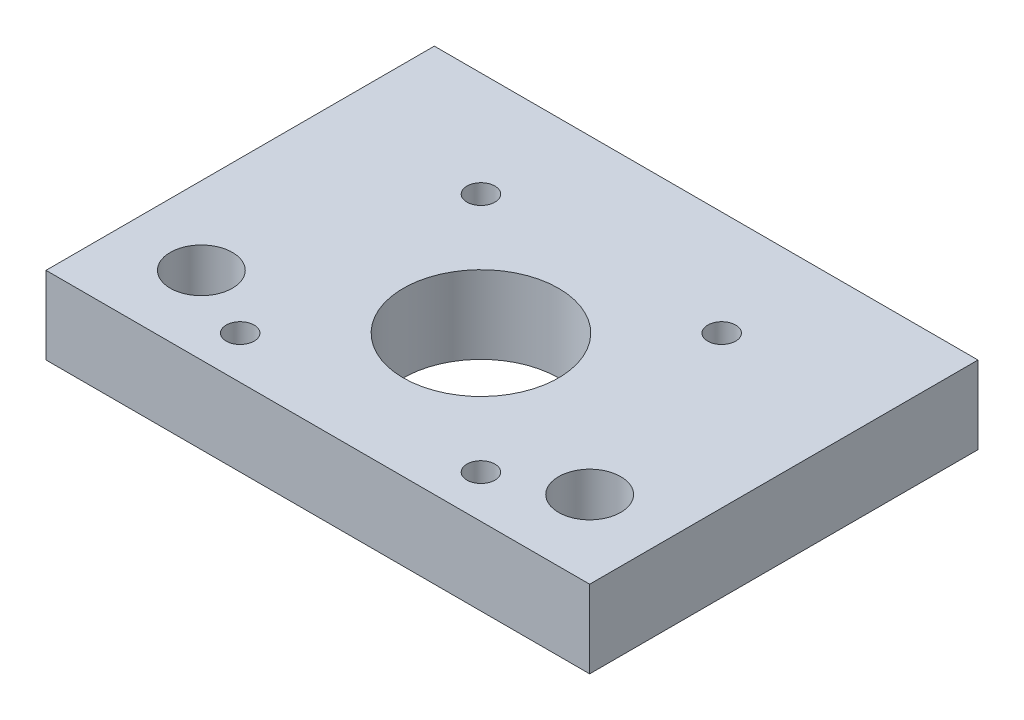
ISO-10303-21;
HEADER;
FILE_DESCRIPTION(('STEP AP214'),'2;1');
FILE_NAME('part.step','',(''),(''),'','','');
FILE_SCHEMA(('AUTOMOTIVE_DESIGN { 1 0 10303 214 1 1 1 1 }'));
ENDSEC;
DATA;
#1=APPLICATION_CONTEXT('core data for automotive mechanical design processes');
#2=APPLICATION_PROTOCOL_DEFINITION('international standard','automotive_design',2000,#1);
#3=PRODUCT_CONTEXT('',#1,'mechanical');
#4=PRODUCT('Part','Part','',(#3));
#5=PRODUCT_RELATED_PRODUCT_CATEGORY('part','',(#4));
#6=PRODUCT_DEFINITION_FORMATION('','',#4);
#7=PRODUCT_DEFINITION_CONTEXT('part definition',#1,'design');
#8=PRODUCT_DEFINITION('design','',#6,#7);
#9=PRODUCT_DEFINITION_SHAPE('','',#8);
#10=(LENGTH_UNIT() NAMED_UNIT(*) SI_UNIT(.MILLI.,.METRE.));
#11=(NAMED_UNIT(*) PLANE_ANGLE_UNIT() SI_UNIT($,.RADIAN.));
#12=(NAMED_UNIT(*) SI_UNIT($,.STERADIAN.) SOLID_ANGLE_UNIT());
#13=UNCERTAINTY_MEASURE_WITH_UNIT(LENGTH_MEASURE(1.E-05),#10,'distance_accuracy_value','');
#14=(GEOMETRIC_REPRESENTATION_CONTEXT(3) GLOBAL_UNCERTAINTY_ASSIGNED_CONTEXT((#13)) GLOBAL_UNIT_ASSIGNED_CONTEXT((#10,
#11,#12)) REPRESENTATION_CONTEXT('',''));
#15=CARTESIAN_POINT('',(0.,0.,0.));
#16=DIRECTION('',(0.,0.,1.));
#17=DIRECTION('',(1.,0.,0.));
#18=AXIS2_PLACEMENT_3D('',#15,#16,#17);
#19=CARTESIAN_POINT('',(-35.,10.,25.));
#20=DIRECTION('',(1.,0.,0.));
#21=DIRECTION('',(0.,0.,-1.));
#22=AXIS2_PLACEMENT_3D('',#19,#20,#21);
#23=PLANE('',#22);
#24=DIRECTION('',(0.,0.,1.));
#25=VECTOR('',#24,1.);
#26=CARTESIAN_POINT('',(-35.,0.,25.));
#27=LINE('',#26,#25);
#28=CARTESIAN_POINT('',(-35.,0.,-25.));
#29=VERTEX_POINT('',#28);
#30=CARTESIAN_POINT('',(-35.,0.,25.));
#31=VERTEX_POINT('',#30);
#32=EDGE_CURVE('E97',#29,#31,#27,.T.);
#33=ORIENTED_EDGE('',*,*,#32,.T.);
#34=DIRECTION('',(0.,-1.,0.));
#35=VECTOR('',#34,1.);
#36=CARTESIAN_POINT('',(-35.,10.,25.));
#37=LINE('',#36,#35);
#38=CARTESIAN_POINT('',(-35.,10.,25.));
#39=VERTEX_POINT('',#38);
#40=EDGE_CURVE('E11',#39,#31,#37,.T.);
#41=ORIENTED_EDGE('',*,*,#40,.F.);
#42=DIRECTION('',(0.,0.,1.));
#43=VECTOR('',#42,1.);
#44=CARTESIAN_POINT('',(-35.,10.,25.));
#45=LINE('',#44,#43);
#46=CARTESIAN_POINT('',(-35.,10.,-25.));
#47=VERTEX_POINT('',#46);
#48=EDGE_CURVE('E85',#47,#39,#45,.T.);
#49=ORIENTED_EDGE('',*,*,#48,.F.);
#50=DIRECTION('',(0.,-1.,0.));
#51=VECTOR('',#50,1.);
#52=CARTESIAN_POINT('',(-35.,10.,-25.));
#53=LINE('',#52,#51);
#54=EDGE_CURVE('E93',#47,#29,#53,.T.);
#55=ORIENTED_EDGE('',*,*,#54,.T.);
#56=EDGE_LOOP('',(#33,#41,#49,#55));
#57=FACE_BOUND('',#56,.T.);
#58=ADVANCED_FACE('F34',(#57),#23,.F.);
#59=CARTESIAN_POINT('',(35.,10.,25.));
#60=DIRECTION('',(0.,0.,-1.));
#61=DIRECTION('',(-1.,0.,0.));
#62=AXIS2_PLACEMENT_3D('',#59,#60,#61);
#63=PLANE('',#62);
#64=DIRECTION('',(1.,0.,0.));
#65=VECTOR('',#64,1.);
#66=CARTESIAN_POINT('',(35.,0.,25.));
#67=LINE('',#66,#65);
#68=CARTESIAN_POINT('',(35.,0.,25.));
#69=VERTEX_POINT('',#68);
#70=EDGE_CURVE('E89',#31,#69,#67,.T.);
#71=ORIENTED_EDGE('',*,*,#70,.T.);
#72=DIRECTION('',(0.,-1.,0.));
#73=VECTOR('',#72,1.);
#74=CARTESIAN_POINT('',(35.,10.,25.));
#75=LINE('',#74,#73);
#76=CARTESIAN_POINT('',(35.,10.,25.));
#77=VERTEX_POINT('',#76);
#78=EDGE_CURVE('E42',#77,#69,#75,.T.);
#79=ORIENTED_EDGE('',*,*,#78,.F.);
#80=DIRECTION('',(1.,0.,0.));
#81=VECTOR('',#80,1.);
#82=CARTESIAN_POINT('',(35.,10.,25.));
#83=LINE('',#82,#81);
#84=EDGE_CURVE('E80',#39,#77,#83,.T.);
#85=ORIENTED_EDGE('',*,*,#84,.F.);
#86=ORIENTED_EDGE('',*,*,#40,.T.);
#87=EDGE_LOOP('',(#71,#79,#85,#86));
#88=FACE_BOUND('',#87,.T.);
#89=ADVANCED_FACE('F88',(#88),#63,.F.);
#90=CARTESIAN_POINT('',(35.,10.,25.));
#91=DIRECTION('',(-1.,0.,0.));
#92=DIRECTION('',(0.,0.,1.));
#93=AXIS2_PLACEMENT_3D('',#90,#91,#92);
#94=PLANE('',#93);
#95=DIRECTION('',(0.,0.,-1.));
#96=VECTOR('',#95,1.);
#97=CARTESIAN_POINT('',(35.,0.,25.));
#98=LINE('',#97,#96);
#99=CARTESIAN_POINT('',(35.,0.,-25.));
#100=VERTEX_POINT('',#99);
#101=EDGE_CURVE('E67',#69,#100,#98,.T.);
#102=ORIENTED_EDGE('',*,*,#101,.T.);
#103=DIRECTION('',(0.,-1.,0.));
#104=VECTOR('',#103,1.);
#105=CARTESIAN_POINT('',(35.,10.,-25.));
#106=LINE('',#105,#104);
#107=CARTESIAN_POINT('',(35.,10.,-25.));
#108=VERTEX_POINT('',#107);
#109=EDGE_CURVE('E90',#108,#100,#106,.T.);
#110=ORIENTED_EDGE('',*,*,#109,.F.);
#111=DIRECTION('',(0.,0.,-1.));
#112=VECTOR('',#111,1.);
#113=CARTESIAN_POINT('',(35.,10.,25.));
#114=LINE('',#113,#112);
#115=EDGE_CURVE('E83',#77,#108,#114,.T.);
#116=ORIENTED_EDGE('',*,*,#115,.F.);
#117=ORIENTED_EDGE('',*,*,#78,.T.);
#118=EDGE_LOOP('',(#102,#110,#116,#117));
#119=FACE_BOUND('',#118,.T.);
#120=ADVANCED_FACE('F91',(#119),#94,.F.);
#121=CARTESIAN_POINT('',(35.,10.,-25.));
#122=DIRECTION('',(0.,0.,1.));
#123=DIRECTION('',(1.,0.,0.));
#124=AXIS2_PLACEMENT_3D('',#121,#122,#123);
#125=PLANE('',#124);
#126=DIRECTION('',(-1.,0.,0.));
#127=VECTOR('',#126,1.);
#128=CARTESIAN_POINT('',(35.,0.,-25.));
#129=LINE('',#128,#127);
#130=EDGE_CURVE('E73',#100,#29,#129,.T.);
#131=ORIENTED_EDGE('',*,*,#130,.T.);
#132=ORIENTED_EDGE('',*,*,#54,.F.);
#133=DIRECTION('',(-1.,0.,0.));
#134=VECTOR('',#133,1.);
#135=CARTESIAN_POINT('',(35.,10.,-25.));
#136=LINE('',#135,#134);
#137=EDGE_CURVE('E50',#108,#47,#136,.T.);
#138=ORIENTED_EDGE('',*,*,#137,.F.);
#139=ORIENTED_EDGE('',*,*,#109,.T.);
#140=EDGE_LOOP('',(#131,#132,#138,#139));
#141=FACE_BOUND('',#140,.T.);
#142=ADVANCED_FACE('F105',(#141),#125,.F.);
#143=CARTESIAN_POINT('',(0.,10.,0.));
#144=DIRECTION('',(0.,1.,0.));
#145=DIRECTION('',(0.,0.,1.));
#146=AXIS2_PLACEMENT_3D('',#143,#144,#145);
#147=PLANE('',#146);
#148=CARTESIAN_POINT('',(5.15281762734335E-13,10.,4.));
#149=DIRECTION('',(0.,-1.,0.));
#150=DIRECTION('',(0.,0.,-1.));
#151=AXIS2_PLACEMENT_3D('',#148,#149,#150);
#152=CIRCLE('',#151,10.);
#153=CARTESIAN_POINT('',(5.15281762734335E-13,10.,-6.00000000000001));
#154=VERTEX_POINT('',#153);
#155=EDGE_CURVE('E130',#154,#154,#152,.T.);
#156=ORIENTED_EDGE('',*,*,#155,.T.);
#157=EDGE_LOOP('',(#156));
#158=FACE_BOUND('',#157,.T.);
#159=CARTESIAN_POINT('',(15.5000000000005,10.,19.5));
#160=DIRECTION('',(0.,-1.,0.));
#161=DIRECTION('',(0.,0.,-1.));
#162=AXIS2_PLACEMENT_3D('',#159,#160,#161);
#163=CIRCLE('',#162,1.80000000000002);
#164=CARTESIAN_POINT('',(15.5000000000005,10.,17.7));
#165=VERTEX_POINT('',#164);
#166=EDGE_CURVE('E126',#165,#165,#163,.T.);
#167=ORIENTED_EDGE('',*,*,#166,.T.);
#168=EDGE_LOOP('',(#167));
#169=FACE_BOUND('',#168,.T.);
#170=CARTESIAN_POINT('',(15.5000000000005,10.,-11.5));
#171=DIRECTION('',(0.,-1.,0.));
#172=DIRECTION('',(0.,0.,-1.));
#173=AXIS2_PLACEMENT_3D('',#170,#171,#172);
#174=CIRCLE('',#173,1.80000000000002);
#175=CARTESIAN_POINT('',(15.5000000000005,10.,-13.3));
#176=VERTEX_POINT('',#175);
#177=EDGE_CURVE('E129',#176,#176,#174,.T.);
#178=ORIENTED_EDGE('',*,*,#177,.T.);
#179=EDGE_LOOP('',(#178));
#180=FACE_BOUND('',#179,.T.);
#181=CARTESIAN_POINT('',(-15.4999999999995,10.,-11.5));
#182=DIRECTION('',(0.,-1.,0.));
#183=DIRECTION('',(0.,0.,-1.));
#184=AXIS2_PLACEMENT_3D('',#181,#182,#183);
#185=CIRCLE('',#184,1.80000000000002);
#186=CARTESIAN_POINT('',(-15.4999999999995,10.,-13.3));
#187=VERTEX_POINT('',#186);
#188=EDGE_CURVE('E125',#187,#187,#185,.T.);
#189=ORIENTED_EDGE('',*,*,#188,.T.);
#190=EDGE_LOOP('',(#189));
#191=FACE_BOUND('',#190,.T.);
#192=CARTESIAN_POINT('',(-15.4999999999995,10.,19.5));
#193=DIRECTION('',(0.,-1.,0.));
#194=DIRECTION('',(0.,0.,-1.));
#195=AXIS2_PLACEMENT_3D('',#192,#193,#194);
#196=CIRCLE('',#195,1.80000000000002);
#197=CARTESIAN_POINT('',(-15.4999999999995,10.,17.7));
#198=VERTEX_POINT('',#197);
#199=EDGE_CURVE('E115',#198,#198,#196,.T.);
#200=ORIENTED_EDGE('',*,*,#199,.T.);
#201=EDGE_LOOP('',(#200));
#202=FACE_BOUND('',#201,.T.);
#203=CARTESIAN_POINT('',(-25.,10.,15.));
#204=DIRECTION('',(0.,1.,0.));
#205=DIRECTION('',(0.,0.,1.));
#206=AXIS2_PLACEMENT_3D('',#203,#204,#205);
#207=CIRCLE('',#206,4.);
#208=CARTESIAN_POINT('',(-25.,10.,19.));
#209=VERTEX_POINT('',#208);
#210=EDGE_CURVE('E118',#209,#209,#207,.T.);
#211=ORIENTED_EDGE('',*,*,#210,.F.);
#212=EDGE_LOOP('',(#211));
#213=FACE_BOUND('',#212,.T.);
#214=CARTESIAN_POINT('',(25.,10.,15.));
#215=DIRECTION('',(0.,1.,0.));
#216=DIRECTION('',(0.,0.,-1.));
#217=AXIS2_PLACEMENT_3D('',#214,#215,#216);
#218=CIRCLE('',#217,4.);
#219=CARTESIAN_POINT('',(25.,10.,11.));
#220=VERTEX_POINT('',#219);
#221=EDGE_CURVE('E111',#220,#220,#218,.T.);
#222=ORIENTED_EDGE('',*,*,#221,.F.);
#223=EDGE_LOOP('',(#222));
#224=FACE_BOUND('',#223,.T.);
#225=ORIENTED_EDGE('',*,*,#48,.T.);
#226=ORIENTED_EDGE('',*,*,#84,.T.);
#227=ORIENTED_EDGE('',*,*,#115,.T.);
#228=ORIENTED_EDGE('',*,*,#137,.T.);
#229=EDGE_LOOP('',(#225,#226,#227,#228));
#230=FACE_BOUND('',#229,.T.);
#231=ADVANCED_FACE('F81',(#158,#169,#180,#191,#202,#213,#224,#230),#147,.T.);
#232=CARTESIAN_POINT('',(0.,0.,0.));
#233=DIRECTION('',(0.,1.,0.));
#234=DIRECTION('',(0.,0.,1.));
#235=AXIS2_PLACEMENT_3D('',#232,#233,#234);
#236=PLANE('',#235);
#237=CARTESIAN_POINT('',(-15.4999999999995,0.,19.5));
#238=DIRECTION('',(0.,-1.,0.));
#239=DIRECTION('',(0.,0.,-1.));
#240=AXIS2_PLACEMENT_3D('',#237,#238,#239);
#241=CIRCLE('',#240,3.47);
#242=CARTESIAN_POINT('',(-15.4999999999995,0.,16.03));
#243=VERTEX_POINT('',#242);
#244=EDGE_CURVE('E161',#243,#243,#241,.T.);
#245=ORIENTED_EDGE('',*,*,#244,.F.);
#246=EDGE_LOOP('',(#245));
#247=FACE_BOUND('',#246,.T.);
#248=CARTESIAN_POINT('',(15.5000000000005,0.,19.5));
#249=DIRECTION('',(0.,-1.,0.));
#250=DIRECTION('',(0.,0.,-1.));
#251=AXIS2_PLACEMENT_3D('',#248,#249,#250);
#252=CIRCLE('',#251,3.47);
#253=CARTESIAN_POINT('',(15.5000000000005,0.,16.03));
#254=VERTEX_POINT('',#253);
#255=EDGE_CURVE('E155',#254,#254,#252,.T.);
#256=ORIENTED_EDGE('',*,*,#255,.F.);
#257=EDGE_LOOP('',(#256));
#258=FACE_BOUND('',#257,.T.);
#259=CARTESIAN_POINT('',(15.5000000000005,0.,-11.5));
#260=DIRECTION('',(0.,-1.,0.));
#261=DIRECTION('',(0.,0.,-1.));
#262=AXIS2_PLACEMENT_3D('',#259,#260,#261);
#263=CIRCLE('',#262,3.47);
#264=CARTESIAN_POINT('',(15.5000000000005,0.,-14.97));
#265=VERTEX_POINT('',#264);
#266=EDGE_CURVE('E149',#265,#265,#263,.T.);
#267=ORIENTED_EDGE('',*,*,#266,.F.);
#268=EDGE_LOOP('',(#267));
#269=FACE_BOUND('',#268,.T.);
#270=CARTESIAN_POINT('',(-15.4999999999995,0.,-11.5));
#271=DIRECTION('',(0.,-1.,0.));
#272=DIRECTION('',(0.,0.,-1.));
#273=AXIS2_PLACEMENT_3D('',#270,#271,#272);
#274=CIRCLE('',#273,3.47);
#275=CARTESIAN_POINT('',(-15.4999999999995,0.,-14.97));
#276=VERTEX_POINT('',#275);
#277=EDGE_CURVE('E143',#276,#276,#274,.T.);
#278=ORIENTED_EDGE('',*,*,#277,.F.);
#279=EDGE_LOOP('',(#278));
#280=FACE_BOUND('',#279,.T.);
#281=CARTESIAN_POINT('',(5.15281762734335E-13,0.,4.));
#282=DIRECTION('',(0.,-1.,0.));
#283=DIRECTION('',(0.,0.,-1.));
#284=AXIS2_PLACEMENT_3D('',#281,#282,#283);
#285=CIRCLE('',#284,10.);
#286=CARTESIAN_POINT('',(5.15281762734335E-13,0.,-6.00000000000001));
#287=VERTEX_POINT('',#286);
#288=EDGE_CURVE('E135',#287,#287,#285,.T.);
#289=ORIENTED_EDGE('',*,*,#288,.F.);
#290=EDGE_LOOP('',(#289));
#291=FACE_BOUND('',#290,.T.);
#292=CARTESIAN_POINT('',(-25.,0.,15.));
#293=DIRECTION('',(0.,1.,0.));
#294=DIRECTION('',(0.,0.,1.));
#295=AXIS2_PLACEMENT_3D('',#292,#293,#294);
#296=CIRCLE('',#295,4.);
#297=CARTESIAN_POINT('',(-25.,0.,19.));
#298=VERTEX_POINT('',#297);
#299=EDGE_CURVE('E100',#298,#298,#296,.T.);
#300=ORIENTED_EDGE('',*,*,#299,.T.);
#301=EDGE_LOOP('',(#300));
#302=FACE_BOUND('',#301,.T.);
#303=CARTESIAN_POINT('',(25.,0.,15.));
#304=DIRECTION('',(0.,1.,0.));
#305=DIRECTION('',(0.,0.,-1.));
#306=AXIS2_PLACEMENT_3D('',#303,#304,#305);
#307=CIRCLE('',#306,4.);
#308=CARTESIAN_POINT('',(25.,0.,11.));
#309=VERTEX_POINT('',#308);
#310=EDGE_CURVE('E114',#309,#309,#307,.T.);
#311=ORIENTED_EDGE('',*,*,#310,.T.);
#312=EDGE_LOOP('',(#311));
#313=FACE_BOUND('',#312,.T.);
#314=ORIENTED_EDGE('',*,*,#32,.F.);
#315=ORIENTED_EDGE('',*,*,#130,.F.);
#316=ORIENTED_EDGE('',*,*,#101,.F.);
#317=ORIENTED_EDGE('',*,*,#70,.F.);
#318=EDGE_LOOP('',(#314,#315,#316,#317));
#319=FACE_BOUND('',#318,.T.);
#320=ADVANCED_FACE('F108',(#247,#258,#269,#280,#291,#302,#313,#319),#236,.F.);
#321=CARTESIAN_POINT('',(25.,0.,15.));
#322=DIRECTION('',(0.,1.,0.));
#323=DIRECTION('',(0.,0.,1.));
#324=AXIS2_PLACEMENT_3D('',#321,#322,#323);
#325=CYLINDRICAL_SURFACE('',#324,4.);
#326=ORIENTED_EDGE('',*,*,#310,.F.);
#327=EDGE_LOOP('',(#326));
#328=FACE_BOUND('',#327,.T.);
#329=ORIENTED_EDGE('',*,*,#221,.T.);
#330=EDGE_LOOP('',(#329));
#331=FACE_BOUND('',#330,.T.);
#332=ADVANCED_FACE('F170',(#328,#331),#325,.F.);
#333=CARTESIAN_POINT('',(-25.,0.,15.));
#334=DIRECTION('',(0.,1.,0.));
#335=DIRECTION('',(0.,0.,1.));
#336=AXIS2_PLACEMENT_3D('',#333,#334,#335);
#337=CYLINDRICAL_SURFACE('',#336,4.);
#338=ORIENTED_EDGE('',*,*,#299,.F.);
#339=EDGE_LOOP('',(#338));
#340=FACE_BOUND('',#339,.T.);
#341=ORIENTED_EDGE('',*,*,#210,.T.);
#342=EDGE_LOOP('',(#341));
#343=FACE_BOUND('',#342,.T.);
#344=ADVANCED_FACE('F186',(#340,#343),#337,.F.);
#345=CARTESIAN_POINT('',(-15.4999999999995,10.,19.5));
#346=DIRECTION('',(0.,-1.,0.));
#347=DIRECTION('',(0.,0.,-1.));
#348=AXIS2_PLACEMENT_3D('',#345,#346,#347);
#349=CYLINDRICAL_SURFACE('',#348,1.80000000000002);
#350=CARTESIAN_POINT('',(-15.4999999999995,1.66999999999999,19.5));
#351=DIRECTION('',(0.,-1.,0.));
#352=DIRECTION('',(0.,0.,-1.));
#353=AXIS2_PLACEMENT_3D('',#350,#351,#352);
#354=CIRCLE('',#353,1.80000000000002);
#355=CARTESIAN_POINT('',(-15.4999999999995,1.66999999999999,17.7));
#356=VERTEX_POINT('',#355);
#357=EDGE_CURVE('E158',#356,#356,#354,.T.);
#358=ORIENTED_EDGE('',*,*,#357,.T.);
#359=EDGE_LOOP('',(#358));
#360=FACE_BOUND('',#359,.T.);
#361=ORIENTED_EDGE('',*,*,#199,.F.);
#362=EDGE_LOOP('',(#361));
#363=FACE_BOUND('',#362,.T.);
#364=ADVANCED_FACE('F228',(#360,#363),#349,.F.);
#365=CARTESIAN_POINT('',(-15.4999999999995,10.,-11.5));
#366=DIRECTION('',(0.,-1.,0.));
#367=DIRECTION('',(0.,0.,-1.));
#368=AXIS2_PLACEMENT_3D('',#365,#366,#367);
#369=CYLINDRICAL_SURFACE('',#368,1.80000000000002);
#370=CARTESIAN_POINT('',(-15.4999999999995,1.66999999999999,-11.5));
#371=DIRECTION('',(0.,-1.,0.));
#372=DIRECTION('',(0.,0.,-1.));
#373=AXIS2_PLACEMENT_3D('',#370,#371,#372);
#374=CIRCLE('',#373,1.80000000000002);
#375=CARTESIAN_POINT('',(-15.4999999999995,1.66999999999999,-13.3));
#376=VERTEX_POINT('',#375);
#377=EDGE_CURVE('E138',#376,#376,#374,.T.);
#378=ORIENTED_EDGE('',*,*,#377,.T.);
#379=EDGE_LOOP('',(#378));
#380=FACE_BOUND('',#379,.T.);
#381=ORIENTED_EDGE('',*,*,#188,.F.);
#382=EDGE_LOOP('',(#381));
#383=FACE_BOUND('',#382,.T.);
#384=ADVANCED_FACE('F263',(#380,#383),#369,.F.);
#385=CARTESIAN_POINT('',(15.5000000000005,10.,-11.5));
#386=DIRECTION('',(0.,-1.,0.));
#387=DIRECTION('',(0.,0.,-1.));
#388=AXIS2_PLACEMENT_3D('',#385,#386,#387);
#389=CYLINDRICAL_SURFACE('',#388,1.80000000000002);
#390=CARTESIAN_POINT('',(15.5000000000005,1.66999999999998,-11.5));
#391=DIRECTION('',(0.,-1.,0.));
#392=DIRECTION('',(0.,0.,-1.));
#393=AXIS2_PLACEMENT_3D('',#390,#391,#392);
#394=CIRCLE('',#393,1.80000000000002);
#395=CARTESIAN_POINT('',(15.5000000000005,1.66999999999998,-13.3));
#396=VERTEX_POINT('',#395);
#397=EDGE_CURVE('E146',#396,#396,#394,.T.);
#398=ORIENTED_EDGE('',*,*,#397,.T.);
#399=EDGE_LOOP('',(#398));
#400=FACE_BOUND('',#399,.T.);
#401=ORIENTED_EDGE('',*,*,#177,.F.);
#402=EDGE_LOOP('',(#401));
#403=FACE_BOUND('',#402,.T.);
#404=ADVANCED_FACE('F273',(#400,#403),#389,.F.);
#405=CARTESIAN_POINT('',(15.5000000000005,10.,19.5));
#406=DIRECTION('',(0.,-1.,0.));
#407=DIRECTION('',(0.,0.,-1.));
#408=AXIS2_PLACEMENT_3D('',#405,#406,#407);
#409=CYLINDRICAL_SURFACE('',#408,1.80000000000002);
#410=CARTESIAN_POINT('',(15.5000000000005,1.66999999999998,19.5));
#411=DIRECTION('',(0.,-1.,0.));
#412=DIRECTION('',(0.,0.,-1.));
#413=AXIS2_PLACEMENT_3D('',#410,#411,#412);
#414=CIRCLE('',#413,1.80000000000002);
#415=CARTESIAN_POINT('',(15.5000000000005,1.66999999999998,17.7));
#416=VERTEX_POINT('',#415);
#417=EDGE_CURVE('E152',#416,#416,#414,.T.);
#418=ORIENTED_EDGE('',*,*,#417,.T.);
#419=EDGE_LOOP('',(#418));
#420=FACE_BOUND('',#419,.T.);
#421=ORIENTED_EDGE('',*,*,#166,.F.);
#422=EDGE_LOOP('',(#421));
#423=FACE_BOUND('',#422,.T.);
#424=ADVANCED_FACE('F246',(#420,#423),#409,.F.);
#425=CARTESIAN_POINT('',(5.15281762734335E-13,10.,4.));
#426=DIRECTION('',(0.,-1.,0.));
#427=DIRECTION('',(0.,0.,-1.));
#428=AXIS2_PLACEMENT_3D('',#425,#426,#427);
#429=CYLINDRICAL_SURFACE('',#428,10.);
#430=ORIENTED_EDGE('',*,*,#155,.F.);
#431=EDGE_LOOP('',(#430));
#432=FACE_BOUND('',#431,.T.);
#433=ORIENTED_EDGE('',*,*,#288,.T.);
#434=EDGE_LOOP('',(#433));
#435=FACE_BOUND('',#434,.T.);
#436=ADVANCED_FACE('F240',(#432,#435),#429,.F.);
#437=CARTESIAN_POINT('',(-15.4999999999995,0.,-11.5));
#438=DIRECTION('',(0.,-1.,0.));
#439=DIRECTION('',(0.,0.,-1.));
#440=AXIS2_PLACEMENT_3D('',#437,#438,#439);
#441=CONICAL_SURFACE('',#440,3.47,0.785398163397448);
#442=ORIENTED_EDGE('',*,*,#277,.T.);
#443=EDGE_LOOP('',(#442));
#444=FACE_BOUND('',#443,.T.);
#445=ORIENTED_EDGE('',*,*,#377,.F.);
#446=EDGE_LOOP('',(#445));
#447=FACE_BOUND('',#446,.T.);
#448=ADVANCED_FACE('F245',(#444,#447),#441,.F.);
#449=CARTESIAN_POINT('',(15.5000000000005,0.,-11.5));
#450=DIRECTION('',(0.,-1.,0.));
#451=DIRECTION('',(0.,0.,-1.));
#452=AXIS2_PLACEMENT_3D('',#449,#450,#451);
#453=CONICAL_SURFACE('',#452,3.47,0.785398163397448);
#454=ORIENTED_EDGE('',*,*,#266,.T.);
#455=EDGE_LOOP('',(#454));
#456=FACE_BOUND('',#455,.T.);
#457=ORIENTED_EDGE('',*,*,#397,.F.);
#458=EDGE_LOOP('',(#457));
#459=FACE_BOUND('',#458,.T.);
#460=ADVANCED_FACE('F297',(#456,#459),#453,.F.);
#461=CARTESIAN_POINT('',(15.5000000000005,0.,19.5));
#462=DIRECTION('',(0.,-1.,0.));
#463=DIRECTION('',(0.,0.,-1.));
#464=AXIS2_PLACEMENT_3D('',#461,#462,#463);
#465=CONICAL_SURFACE('',#464,3.47,0.785398163397448);
#466=ORIENTED_EDGE('',*,*,#255,.T.);
#467=EDGE_LOOP('',(#466));
#468=FACE_BOUND('',#467,.T.);
#469=ORIENTED_EDGE('',*,*,#417,.F.);
#470=EDGE_LOOP('',(#469));
#471=FACE_BOUND('',#470,.T.);
#472=ADVANCED_FACE('F307',(#468,#471),#465,.F.);
#473=CARTESIAN_POINT('',(-15.4999999999995,0.,19.5));
#474=DIRECTION('',(0.,-1.,0.));
#475=DIRECTION('',(0.,0.,-1.));
#476=AXIS2_PLACEMENT_3D('',#473,#474,#475);
#477=CONICAL_SURFACE('',#476,3.47,0.785398163397448);
#478=ORIENTED_EDGE('',*,*,#244,.T.);
#479=EDGE_LOOP('',(#478));
#480=FACE_BOUND('',#479,.T.);
#481=ORIENTED_EDGE('',*,*,#357,.F.);
#482=EDGE_LOOP('',(#481));
#483=FACE_BOUND('',#482,.T.);
#484=ADVANCED_FACE('F165',(#480,#483),#477,.F.);
#485=CLOSED_SHELL('',(#58,#89,#120,#142,#231,#320,#332,#344,#364,#384,#404,#424,#436,#448,#460,
#472,#484));
#486=MANIFOLD_SOLID_BREP('B2',#485);
#487=ADVANCED_BREP_SHAPE_REPRESENTATION('',(#18,#486),#14);
#488=SHAPE_DEFINITION_REPRESENTATION(#9,#487);
ENDSEC;
END-ISO-10303-21;
